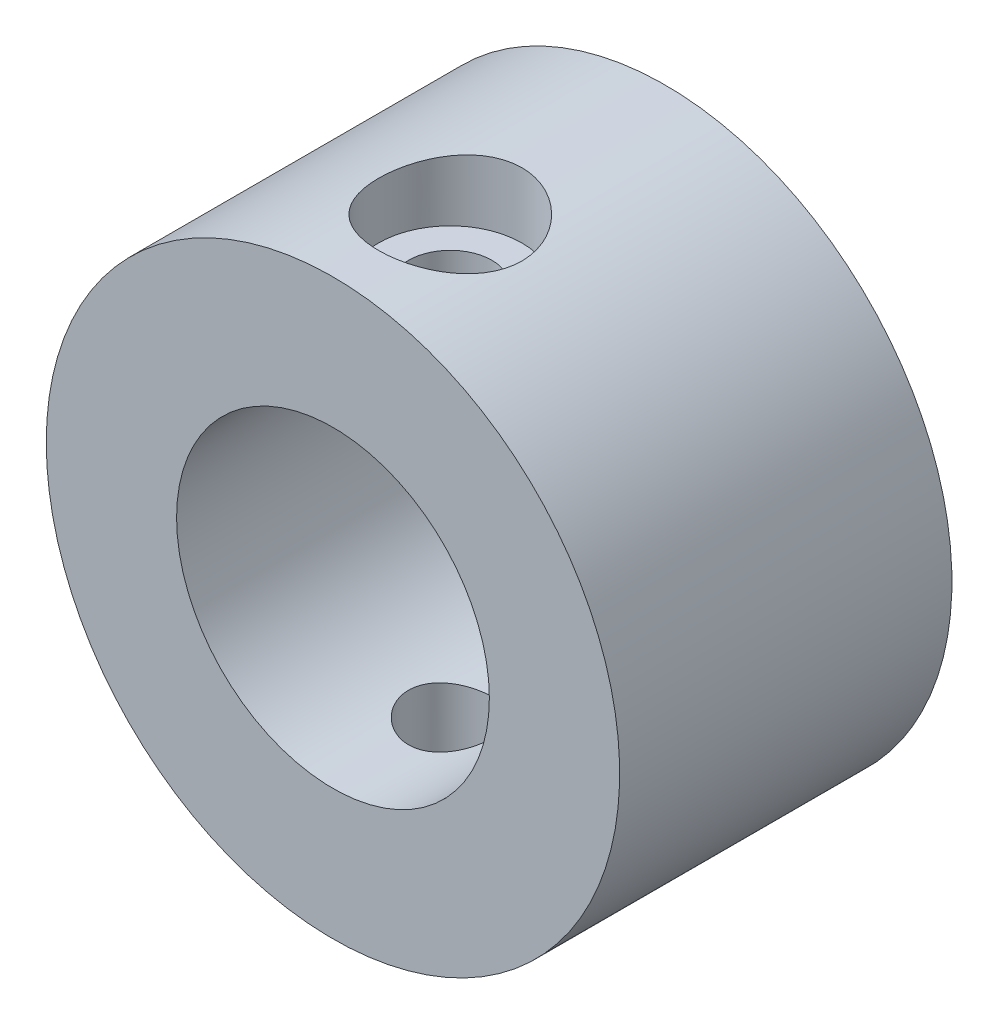
ISO-10303-21;
HEADER;
FILE_DESCRIPTION(('STEP AP214'),'2;1');
FILE_NAME('part.step','',(''),(''),'','','');
FILE_SCHEMA(('AUTOMOTIVE_DESIGN { 1 0 10303 214 1 1 1 1 }'));
ENDSEC;
DATA;
#1=APPLICATION_CONTEXT('core data for automotive mechanical design processes');
#2=APPLICATION_PROTOCOL_DEFINITION('international standard','automotive_design',2000,#1);
#3=PRODUCT_CONTEXT('',#1,'mechanical');
#4=PRODUCT('Part','Part','',(#3));
#5=PRODUCT_RELATED_PRODUCT_CATEGORY('part','',(#4));
#6=PRODUCT_DEFINITION_FORMATION('','',#4);
#7=PRODUCT_DEFINITION_CONTEXT('part definition',#1,'design');
#8=PRODUCT_DEFINITION('design','',#6,#7);
#9=PRODUCT_DEFINITION_SHAPE('','',#8);
#10=(LENGTH_UNIT() NAMED_UNIT(*) SI_UNIT(.MILLI.,.METRE.));
#11=(NAMED_UNIT(*) PLANE_ANGLE_UNIT() SI_UNIT($,.RADIAN.));
#12=(NAMED_UNIT(*) SI_UNIT($,.STERADIAN.) SOLID_ANGLE_UNIT());
#13=UNCERTAINTY_MEASURE_WITH_UNIT(LENGTH_MEASURE(1.E-05),#10,'distance_accuracy_value','');
#14=(GEOMETRIC_REPRESENTATION_CONTEXT(3) GLOBAL_UNCERTAINTY_ASSIGNED_CONTEXT((#13)) GLOBAL_UNIT_ASSIGNED_CONTEXT((#10,
#11,#12)) REPRESENTATION_CONTEXT('',''));
#15=CARTESIAN_POINT('',(0.,0.,0.));
#16=DIRECTION('',(0.,0.,1.));
#17=DIRECTION('',(1.,0.,0.));
#18=AXIS2_PLACEMENT_3D('',#15,#16,#17);
#19=CARTESIAN_POINT('',(0.,0.,0.));
#20=DIRECTION('',(0.,0.,1.));
#21=DIRECTION('',(-1.,0.,0.));
#22=AXIS2_PLACEMENT_3D('',#19,#20,#21);
#23=CYLINDRICAL_SURFACE('',#22,11.);
#24=CARTESIAN_POINT('',(0.,0.,-2.74688758676846));
#25=DIRECTION('',(0.,0.,-1.));
#26=DIRECTION('',(-1.,0.,0.));
#27=AXIS2_PLACEMENT_3D('',#24,#25,#26);
#28=CIRCLE('',#27,11.);
#29=CARTESIAN_POINT('',(-11.,0.,-2.74688758676847));
#30=VERTEX_POINT('',#29);
#31=EDGE_CURVE('E319',#30,#30,#28,.T.);
#32=ORIENTED_EDGE('',*,*,#31,.F.);
#33=EDGE_LOOP('',(#32));
#34=FACE_BOUND('',#33,.T.);
#35=CARTESIAN_POINT('',(0.,0.,10.));
#36=DIRECTION('',(0.,0.,-1.));
#37=DIRECTION('',(-1.,0.,0.));
#38=AXIS2_PLACEMENT_3D('',#35,#36,#37);
#39=CIRCLE('',#38,11.);
#40=CARTESIAN_POINT('',(-11.,0.,10.));
#41=VERTEX_POINT('',#40);
#42=EDGE_CURVE('E315',#41,#41,#39,.T.);
#43=ORIENTED_EDGE('',*,*,#42,.T.);
#44=EDGE_LOOP('',(#43));
#45=FACE_BOUND('',#44,.T.);
#46=CARTESIAN_POINT('',(0.,11.,2.75));
#47=CARTESIAN_POINT('',(-0.151939495894507,10.9999974309136,2.75000426385329));
#48=CARTESIAN_POINT('',(-0.303926622689732,10.9968205990835,2.76263450975194));
#49=CARTESIAN_POINT('',(-0.603544926912643,10.9844554202147,2.81274611072951));
#50=CARTESIAN_POINT('',(-0.751173585929689,10.9752636660329,2.85024155081939));
#51=CARTESIAN_POINT('',(-1.03770493233472,10.9518864827539,2.94880529801382));
#52=CARTESIAN_POINT('',(-1.17661786628834,10.9377070521044,3.00984529764466));
#53=CARTESIAN_POINT('',(-1.44223224182478,10.9058646364731,3.15366588174888));
#54=CARTESIAN_POINT('',(-1.56893327130607,10.8882015339929,3.23644719955144));
#55=CARTESIAN_POINT('',(-1.80913686671835,10.8509025825144,3.42320144769933));
#56=CARTESIAN_POINT('',(-1.92235209844527,10.8312362977156,3.52753788742494));
#57=CARTESIAN_POINT('',(-2.12987303320609,10.7923497021622,3.75366237566656));
#58=CARTESIAN_POINT('',(-2.22417660107352,10.7731294419809,3.87545239206938));
#59=CARTESIAN_POINT('',(-2.39254866179812,10.7370042211331,4.13525791568448));
#60=CARTESIAN_POINT('',(-2.46629572919609,10.7201378985215,4.273487589816));
#61=CARTESIAN_POINT('',(-2.58939433234303,10.6910740716636,4.5608720880434));
#62=CARTESIAN_POINT('',(-2.63874976830692,10.6788758210643,4.71002516110869));
#63=CARTESIAN_POINT('',(-2.7106838674754,10.6608420727659,5.01186308003637));
#64=CARTESIAN_POINT('',(-2.73377915860876,10.6548840016119,5.16441730940299));
#65=CARTESIAN_POINT('',(-2.75414658762175,10.6496383117592,5.4713423764988));
#66=CARTESIAN_POINT('',(-2.75142292666654,10.6503496078454,5.62571291460225));
#67=CARTESIAN_POINT('',(-2.72064196183946,10.6582521011416,5.92792898086648));
#68=CARTESIAN_POINT('',(-2.69320029034949,10.6652858218004,6.07584197268644));
#69=CARTESIAN_POINT('',(-2.61474434265549,10.6847896773029,6.36489526000361));
#70=CARTESIAN_POINT('',(-2.56372838712722,10.697260199436,6.50603507221969));
#71=CARTESIAN_POINT('',(-2.43904737621817,10.7263770882704,6.7791863631289));
#72=CARTESIAN_POINT('',(-2.36515888992702,10.7430643369466,6.91109131494754));
#73=CARTESIAN_POINT('',(-2.1969865060274,10.7787113655098,7.1608509678875));
#74=CARTESIAN_POINT('',(-2.10269903948287,10.7976715428015,7.27870320478996));
#75=CARTESIAN_POINT('',(-1.89321627858224,10.8363911432313,7.50053996210641));
#76=CARTESIAN_POINT('',(-1.77750147330408,10.85615794043,7.60403323177914));
#77=CARTESIAN_POINT('',(-1.53012184875678,10.8937760356105,7.79023894451715));
#78=CARTESIAN_POINT('',(-1.39845654246456,10.9116272750725,7.87295075281653));
#79=CARTESIAN_POINT('',(-1.12221246258255,10.9434917550602,8.01542607474471));
#80=CARTESIAN_POINT('',(-0.977590887549143,10.9574916023417,8.07510979046645));
#81=CARTESIAN_POINT('',(-0.679939348261952,10.979978478176,8.16918172713422));
#82=CARTESIAN_POINT('',(-0.526910998442555,10.9884665612201,8.20357478676659));
#83=CARTESIAN_POINT('',(-0.220989945715049,10.9988174866419,8.2453388701912));
#84=CARTESIAN_POINT('',(-0.068193986645052,11.0008443143184,8.25337888113805));
#85=CARTESIAN_POINT('',(0.236560270469432,10.9985114215983,8.24404349623161));
#86=CARTESIAN_POINT('',(0.38851864268176,10.9941522761006,8.22667038820158));
#87=CARTESIAN_POINT('',(0.684959492756899,10.9796423206681,8.16755333461581));
#88=CARTESIAN_POINT('',(0.829519384776042,10.9695782934061,8.12617435029222));
#89=CARTESIAN_POINT('',(1.10963836949628,10.9447929549596,8.02063701261449));
#90=CARTESIAN_POINT('',(1.24519655155986,10.9300711734496,7.95647635875909));
#91=CARTESIAN_POINT('',(1.50612574645469,10.8972106453141,7.80590043039643));
#92=CARTESIAN_POINT('',(1.63127331003224,10.879015901721,7.7191104606063));
#93=CARTESIAN_POINT('',(1.86546545834607,10.8413160017755,7.52621850053853));
#94=CARTESIAN_POINT('',(1.97450725811762,10.8218106196374,7.42011317736765));
#95=CARTESIAN_POINT('',(2.17614937479955,10.7830975442575,7.18849640511987));
#96=CARTESIAN_POINT('',(2.26828042397202,10.7639089100121,7.06257254450081));
#97=CARTESIAN_POINT('',(2.43010305819165,10.7285361036708,6.7966568368076));
#98=CARTESIAN_POINT('',(2.49979563929591,10.7123517982244,6.65666561455419));
#99=CARTESIAN_POINT('',(2.61424427111346,10.6849984031413,6.3673395089219));
#100=CARTESIAN_POINT('',(2.65914806051324,10.6737996791339,6.21806601476079));
#101=CARTESIAN_POINT('',(2.72313370989538,10.6576569737724,5.91376566393196));
#102=CARTESIAN_POINT('',(2.74222121703917,10.6527116245445,5.75874007312734));
#103=CARTESIAN_POINT('',(2.75373741561691,10.6497398557177,5.45211145625372));
#104=CARTESIAN_POINT('',(2.74691614593145,10.6515187667684,5.30053803560151));
#105=CARTESIAN_POINT('',(2.70852501023903,10.6613449983936,5.00077620411185));
#106=CARTESIAN_POINT('',(2.67695564159208,10.669392192995,4.85258772530915));
#107=CARTESIAN_POINT('',(2.59037408564545,10.6907397792054,4.56461782504592));
#108=CARTESIAN_POINT('',(2.53550257524744,10.7040086126716,4.42479160705939));
#109=CARTESIAN_POINT('',(2.40398567494254,10.7343088549492,4.15623013169179));
#110=CARTESIAN_POINT('',(2.32733726506265,10.7513407855459,4.02749641582405));
#111=CARTESIAN_POINT('',(2.15209087250144,10.7878032948327,3.78114984682957));
#112=CARTESIAN_POINT('',(2.05297246533914,10.8072848552493,3.66391469872273));
#113=CARTESIAN_POINT('',(1.83661384718117,10.8461471661815,3.44749708454177));
#114=CARTESIAN_POINT('',(1.71936933897876,10.8655278916626,3.34831891145956));
#115=CARTESIAN_POINT('',(1.46752390895475,10.9024236868739,3.16907926763155));
#116=CARTESIAN_POINT('',(1.33264710758004,10.9198986117076,3.0893965416021));
#117=CARTESIAN_POINT('',(1.0509877757692,10.9505902912105,2.95396298460903));
#118=CARTESIAN_POINT('',(0.904213866300687,10.9638100953293,2.89819500547768));
#119=CARTESIAN_POINT('',(0.631418797613031,10.9825477587016,2.82045164439564));
#120=CARTESIAN_POINT('',(0.506696979998125,10.9890473926327,2.79408938773537));
#121=CARTESIAN_POINT('',(0.254661131149852,10.9977744292524,2.75886243669311));
#122=CARTESIAN_POINT('',(0.127347295611463,11.0000021532664,2.74999642627361));
#123=CARTESIAN_POINT('',(0.,11.,2.75));
#124=B_SPLINE_CURVE_WITH_KNOTS('',3,(#46,#47,#48,#49,#50,#51,#52,#53,#54,#55,#56,#57,#58,#59,
#60,#61,#62,#63,#64,#65,#66,#67,#68,#69,#70,#71,#72,#73,#74,#75,#76,#77,#78,#79,#80,#81,#82,#83,
#84,#85,#86,#87,#88,#89,#90,#91,#92,#93,#94,#95,#96,#97,#98,#99,#100,#101,#102,#103,#104,#105,
#106,#107,#108,#109,#110,#111,#112,#113,#114,#115,#116,#117,#118,#119,#120,#121,#122,#123),
.UNSPECIFIED.,.T.,.F.,(4,2,2,2,2,2,2,2,2,2,2,2,2,2,2,2,2,2,2,2,2,2,2,2,2,2,2,2,2,2,2,2,2,2,2,2,
2,2,4),(0.,0.455351806198464,0.910961769233816,1.36602565419119,1.82110489031043,
2.28459798301422,2.74814337563447,3.21857520500646,3.68893178810509,4.14986541018628,
4.61072403212699,5.06041244518954,5.51013289693825,5.964393011082,6.41873266539053,
6.88602751782623,7.35333664196208,7.82225086522797,8.29107535101933,8.74790233079761,
9.20468818712783,9.65470503281823,10.1047673343029,10.5628157720923,11.0209433218746,
11.4903160021429,11.9596678438019,12.426191334674,12.8926127597352,13.3456359740823,
13.7986500843017,14.2489673436976,14.6993470826176,15.1614755676228,15.6237137792321,
16.0943234009335,16.5645950034992,16.9462744540472,17.3279251942302),.UNSPECIFIED.);
#125=CARTESIAN_POINT('',(0.,11.,2.75));
#126=VERTEX_POINT('',#125);
#127=EDGE_CURVE('E125',#126,#126,#124,.T.);
#128=ORIENTED_EDGE('',*,*,#127,.F.);
#129=EDGE_LOOP('',(#128));
#130=FACE_BOUND('',#129,.T.);
#131=CARTESIAN_POINT('',(0.,0.,2.65));
#132=DIRECTION('',(0.,0.,-1.));
#133=DIRECTION('',(-1.,0.,0.));
#134=AXIS2_PLACEMENT_3D('',#131,#132,#133);
#135=CIRCLE('',#134,11.);
#136=CARTESIAN_POINT('',(1.64544826719043,-10.8762355619948,2.65));
#137=VERTEX_POINT('',#136);
#138=CARTESIAN_POINT('',(-1.64544826719043,-10.8762355619948,2.65));
#139=VERTEX_POINT('',#138);
#140=EDGE_CURVE('E11',#137,#139,#135,.T.);
#141=ORIENTED_EDGE('',*,*,#140,.T.);
#142=CARTESIAN_POINT('',(0.,0.,-0.200000000000003));
#143=DIRECTION('',(-0.866025403784439,0.,-0.5));
#144=DIRECTION('',(-0.5,0.,0.866025403784439));
#145=AXIS2_PLACEMENT_3D('',#142,#143,#144);
#146=ELLIPSE('',#145,22.,11.);
#147=CARTESIAN_POINT('',(-3.29089653438087,-10.4961897848696,5.5));
#148=VERTEX_POINT('',#147);
#149=EDGE_CURVE('E317',#139,#148,#146,.T.);
#150=ORIENTED_EDGE('',*,*,#149,.T.);
#151=CARTESIAN_POINT('',(0.,0.,11.2));
#152=DIRECTION('',(-0.866025403784439,0.,0.5));
#153=DIRECTION('',(0.5,0.,0.866025403784439));
#154=AXIS2_PLACEMENT_3D('',#151,#152,#153);
#155=ELLIPSE('',#154,22.,11.);
#156=CARTESIAN_POINT('',(-1.64544826719043,-10.8762355619948,8.35));
#157=VERTEX_POINT('',#156);
#158=EDGE_CURVE('E346',#148,#157,#155,.T.);
#159=ORIENTED_EDGE('',*,*,#158,.T.);
#160=CARTESIAN_POINT('',(0.,0.,8.35));
#161=DIRECTION('',(0.,0.,1.));
#162=DIRECTION('',(1.,0.,0.));
#163=AXIS2_PLACEMENT_3D('',#160,#161,#162);
#164=CIRCLE('',#163,11.);
#165=CARTESIAN_POINT('',(1.64544826719043,-10.8762355619948,8.35));
#166=VERTEX_POINT('',#165);
#167=EDGE_CURVE('E342',#157,#166,#164,.T.);
#168=ORIENTED_EDGE('',*,*,#167,.T.);
#169=CARTESIAN_POINT('',(0.,0.,11.2));
#170=DIRECTION('',(0.866025403784439,0.,0.5));
#171=DIRECTION('',(-0.5,0.,0.866025403784439));
#172=AXIS2_PLACEMENT_3D('',#169,#170,#171);
#173=ELLIPSE('',#172,22.,11.);
#174=CARTESIAN_POINT('',(3.29089653438087,-10.4961897848696,5.5));
#175=VERTEX_POINT('',#174);
#176=EDGE_CURVE('E341',#166,#175,#173,.T.);
#177=ORIENTED_EDGE('',*,*,#176,.T.);
#178=CARTESIAN_POINT('',(0.,0.,-0.199999999999999));
#179=DIRECTION('',(0.866025403784439,0.,-0.5));
#180=DIRECTION('',(0.5,0.,0.866025403784439));
#181=AXIS2_PLACEMENT_3D('',#178,#179,#180);
#182=ELLIPSE('',#181,22.,11.);
#183=EDGE_CURVE('E43',#175,#137,#182,.T.);
#184=ORIENTED_EDGE('',*,*,#183,.T.);
#185=EDGE_LOOP('',(#141,#150,#159,#168,#177,#184));
#186=FACE_BOUND('',#185,.T.);
#187=ADVANCED_FACE('F35',(#34,#45,#130,#186),#23,.T.);
#188=CARTESIAN_POINT('',(0.,-11.,5.5));
#189=DIRECTION('',(0.,1.,0.));
#190=DIRECTION('',(0.,0.,-1.));
#191=AXIS2_PLACEMENT_3D('',#188,#189,#190);
#192=CYLINDRICAL_SURFACE('',#191,1.6);
#193=CARTESIAN_POINT('',(0.,6.,3.9));
#194=CARTESIAN_POINT('',(0.0882036446662834,5.9999986704813,3.90000209354788));
#195=CARTESIAN_POINT('',(0.176429728177472,5.99803588929723,3.90731809135174));
#196=CARTESIAN_POINT('',(0.350340361083571,5.99039658897325,3.93633698459095));
#197=CARTESIAN_POINT('',(0.436023666655269,5.98471828266059,3.95804680354089));
#198=CARTESIAN_POINT('',(0.60231327123625,5.97027466602242,4.01509733349123));
#199=CARTESIAN_POINT('',(0.682925960812229,5.96151333704337,4.05042047013283));
#200=CARTESIAN_POINT('',(0.837082949114126,5.94182959321305,4.13362979413328));
#201=CARTESIAN_POINT('',(0.910626776359695,5.93090703436005,4.18151681868739));
#202=CARTESIAN_POINT('',(1.05026360299202,5.90779691921738,4.28966681313074));
#203=CARTESIAN_POINT('',(1.11616935189025,5.8955877414348,4.35016693440678));
#204=CARTESIAN_POINT('',(1.23702970928508,5.87141927743138,4.48131878645052));
#205=CARTESIAN_POINT('',(1.29198290796523,5.85946002355797,4.55197182209339));
#206=CARTESIAN_POINT('',(1.39029127394741,5.83692429973529,4.702918587861));
#207=CARTESIAN_POINT('',(1.43343102189222,5.82637510858234,4.78335706261178));
#208=CARTESIAN_POINT('',(1.50550038461563,5.80817181846908,4.95067208887154));
#209=CARTESIAN_POINT('',(1.53443261960976,5.8005171857408,5.03754744985618));
#210=CARTESIAN_POINT('',(1.5766153618114,5.78919292669855,5.21319643026132));
#211=CARTESIAN_POINT('',(1.59020536195949,5.78543718352245,5.30188283196172));
#212=CARTESIAN_POINT('',(1.60237627764874,5.78207864835752,5.48035014666633));
#213=CARTESIAN_POINT('',(1.60095999764589,5.78247508038722,5.57013085202849));
#214=CARTESIAN_POINT('',(1.58342808002097,5.78729903015237,5.7455883322979));
#215=CARTESIAN_POINT('',(1.56772324851795,5.79161388402151,5.83130974563043));
#216=CARTESIAN_POINT('',(1.52271798977763,5.80360810471624,5.99885466756536));
#217=CARTESIAN_POINT('',(1.493416475944,5.81128774043995,6.08067786406037));
#218=CARTESIAN_POINT('',(1.421714855722,5.82924529396782,6.23917451504676));
#219=CARTESIAN_POINT('',(1.37917072910226,5.83955154254445,6.31577947142898));
#220=CARTESIAN_POINT('',(1.28229203059023,5.86158583714473,6.46090732708125));
#221=CARTESIAN_POINT('',(1.22795513779402,5.8733141628429,6.52942863132518));
#222=CARTESIAN_POINT('',(1.10693285810735,5.89734008503746,6.65879119796383));
#223=CARTESIAN_POINT('',(1.03990250182639,5.90964377191026,6.71930905465196));
#224=CARTESIAN_POINT('',(0.896494134565099,5.93309105021092,6.82831102428023));
#225=CARTESIAN_POINT('',(0.820115755364073,5.94423459590854,6.87679466296194));
#226=CARTESIAN_POINT('',(0.659678604397961,5.96417456318624,6.96049432225972));
#227=CARTESIAN_POINT('',(0.575587922041431,5.97296058266845,6.99565181635887));
#228=CARTESIAN_POINT('',(0.402401835512317,5.98712035520802,7.0512377510507));
#229=CARTESIAN_POINT('',(0.313307529542659,5.99249485386999,7.07166941017917));
#230=CARTESIAN_POINT('',(0.135403266516412,5.99911326846707,7.09671590153426));
#231=CARTESIAN_POINT('',(0.0466593901131035,6.00047197976769,7.10177043188069));
#232=CARTESIAN_POINT('',(-0.130408036720959,5.99923577353354,7.09713346860245));
#233=CARTESIAN_POINT('',(-0.218731629649689,5.99664126464274,7.08744349911539));
#234=CARTESIAN_POINT('',(-0.390881959921425,5.98786428396825,7.05395324203201));
#235=CARTESIAN_POINT('',(-0.474759881622231,5.98174421237093,7.03039820304177));
#236=CARTESIAN_POINT('',(-0.637365576940845,5.96661035915282,6.97013124439366));
#237=CARTESIAN_POINT('',(-0.716092791372797,5.9575962639682,6.93341789899964));
#238=CARTESIAN_POINT('',(-0.867870779734385,5.93740528447735,6.8470608902555));
#239=CARTESIAN_POINT('',(-0.94078015076904,5.92618949284386,6.79717802656153));
#240=CARTESIAN_POINT('',(-1.07734770831762,5.9028916189203,6.68619869587388));
#241=CARTESIAN_POINT('',(-1.14100406303899,5.89080936580444,6.62510001392018));
#242=CARTESIAN_POINT('',(-1.25911139583055,5.8667179669498,6.4913715380033));
#243=CARTESIAN_POINT('',(-1.31325215399989,5.85472049149563,6.41846515087989));
#244=CARTESIAN_POINT('',(-1.40853752947959,5.83253157740069,6.26434824312428));
#245=CARTESIAN_POINT('',(-1.44968268897221,5.82234006342218,6.18313806911701));
#246=CARTESIAN_POINT('',(-1.51749929269189,5.80503414721321,6.01512375432943));
#247=CARTESIAN_POINT('',(-1.54425449804718,5.79790198738987,5.9283553505015));
#248=CARTESIAN_POINT('',(-1.58272964096634,5.78751860185751,5.75132854421294));
#249=CARTESIAN_POINT('',(-1.5944534208239,5.78426638438256,5.66107103970634));
#250=CARTESIAN_POINT('',(-1.60231191722602,5.78209395637349,5.48280416970196));
#251=CARTESIAN_POINT('',(-1.59894524494388,5.78303518188826,5.39481814379578));
#252=CARTESIAN_POINT('',(-1.5778750080045,5.78881916870635,5.22071718878957));
#253=CARTESIAN_POINT('',(-1.56017181228047,5.7936618296109,5.1346022115989));
#254=CARTESIAN_POINT('',(-1.51122012559733,5.80662056856999,4.96731539829676));
#255=CARTESIAN_POINT('',(-1.48007728860457,5.81471108015306,4.88611052581443));
#256=CARTESIAN_POINT('',(-1.40521243649916,5.83325454509352,4.73001693557252));
#257=CARTESIAN_POINT('',(-1.36148844819695,5.84370786897202,4.65512921095956));
#258=CARTESIAN_POINT('',(-1.26119127415051,5.86618337152254,4.51141571240275));
#259=CARTESIAN_POINT('',(-1.20427783814327,5.87824266481322,4.44283317201904));
#260=CARTESIAN_POINT('',(-1.07986442808881,5.90236403026437,4.31603003866613));
#261=CARTESIAN_POINT('',(-1.012361883487,5.91442610238761,4.25781196906492));
#262=CARTESIAN_POINT('',(-0.866943984870946,5.93750249923166,4.15216620988252));
#263=CARTESIAN_POINT('',(-0.788836769401423,5.94848889051638,4.10499599148054));
#264=CARTESIAN_POINT('',(-0.625510912333512,5.9678704808232,4.02453006725651));
#265=CARTESIAN_POINT('',(-0.540296875757038,5.97626734146876,3.99122545946912));
#266=CARTESIAN_POINT('',(-0.379499763904793,5.98843802010774,3.94377977166759));
#267=CARTESIAN_POINT('',(-0.304609613252029,5.99274216474082,3.927400493126));
#268=CARTESIAN_POINT('',(-0.153151836253661,5.99852359229165,3.90551023506635));
#269=CARTESIAN_POINT('',(-0.0765843763238884,6.00000115437815,3.89999818223998));
#270=CARTESIAN_POINT('',(0.,6.,3.9));
#271=B_SPLINE_CURVE_WITH_KNOTS('',3,(#193,#194,#195,#196,#197,#198,#199,#200,#201,#202,#203,
#204,#205,#206,#207,#208,#209,#210,#211,#212,#213,#214,#215,#216,#217,#218,#219,#220,#221,#222,
#223,#224,#225,#226,#227,#228,#229,#230,#231,#232,#233,#234,#235,#236,#237,#238,#239,#240,#241,
#242,#243,#244,#245,#246,#247,#248,#249,#250,#251,#252,#253,#254,#255,#256,#257,#258,#259,#260,
#261,#262,#263,#264,#265,#266,#267,#268,#269,#270),.UNSPECIFIED.,.T.,.F.,(4,2,2,2,2,2,2,2,2,2,2,
2,2,2,2,2,2,2,2,2,2,2,2,2,2,2,2,2,2,2,2,2,2,2,2,2,2,2,4),(0.,0.264330079159655,0.52878739500916,
0.792904442377546,1.0570390936694,1.32667918363973,1.59635395940119,1.87066066018583,
2.1449167530376,2.41297726598071,2.68098768318787,2.94152801632129,3.20208917445683,
3.4655893867253,3.72914150489435,4.00129007845189,4.27344937545409,4.54679047677764,
4.82007181747442,5.08546174014969,5.35082423135612,5.61162828509024,5.87246060615823,
6.13840228798971,6.40439654602441,6.67789197101562,6.95137598414617,7.2232503815319,
7.49505526923061,7.75794673914764,8.0208314440835,8.28168612350517,8.54258173690277,
8.81115471648986,9.07979299457834,9.35417801816593,9.62838660908019,9.85791855186544,
10.0874278236498),.UNSPECIFIED.);
#272=CARTESIAN_POINT('',(0.,6.,3.9));
#273=VERTEX_POINT('',#272);
#274=EDGE_CURVE('E117',#273,#273,#271,.T.);
#275=ORIENTED_EDGE('',*,*,#274,.T.);
#276=EDGE_LOOP('',(#275));
#277=FACE_BOUND('',#276,.T.);
#278=CARTESIAN_POINT('',(0.,8.5,5.5));
#279=DIRECTION('',(0.,-1.,0.));
#280=DIRECTION('',(0.,0.,-1.));
#281=AXIS2_PLACEMENT_3D('',#278,#279,#280);
#282=CIRCLE('',#281,1.6);
#283=CARTESIAN_POINT('',(0.,8.5,3.9));
#284=VERTEX_POINT('',#283);
#285=EDGE_CURVE('E116',#284,#284,#282,.F.);
#286=ORIENTED_EDGE('',*,*,#285,.T.);
#287=EDGE_LOOP('',(#286));
#288=FACE_BOUND('',#287,.T.);
#289=ADVANCED_FACE('F148',(#277,#288),#192,.F.);
#290=CARTESIAN_POINT('',(0.,0.,0.));
#291=DIRECTION('',(0.,0.,-1.));
#292=DIRECTION('',(1.,0.,0.));
#293=AXIS2_PLACEMENT_3D('',#290,#291,#292);
#294=PLANE('',#293);
#295=CARTESIAN_POINT('',(0.,0.,0.));
#296=DIRECTION('',(0.,0.,-1.));
#297=DIRECTION('',(-1.,0.,0.));
#298=AXIS2_PLACEMENT_3D('',#295,#296,#297);
#299=CIRCLE('',#298,6.);
#300=CARTESIAN_POINT('',(-6.,0.,0.));
#301=VERTEX_POINT('',#300);
#302=EDGE_CURVE('E311',#301,#301,#299,.T.);
#303=ORIENTED_EDGE('',*,*,#302,.F.);
#304=EDGE_LOOP('',(#303));
#305=FACE_BOUND('',#304,.T.);
#306=ADVANCED_FACE('F37',(#305),#294,.F.);
#307=CARTESIAN_POINT('',(0.,0.,0.));
#308=DIRECTION('',(0.,0.,1.));
#309=DIRECTION('',(-1.,0.,0.));
#310=AXIS2_PLACEMENT_3D('',#307,#308,#309);
#311=CYLINDRICAL_SURFACE('',#310,6.);
#312=CARTESIAN_POINT('',(0.,-6.,3.9));
#313=CARTESIAN_POINT('',(-0.0882036446662834,-5.9999986704813,3.90000209354788));
#314=CARTESIAN_POINT('',(-0.176429728177473,-5.99803588929723,3.90731809135174));
#315=CARTESIAN_POINT('',(-0.350340361083571,-5.99039658897325,3.93633698459095));
#316=CARTESIAN_POINT('',(-0.436023666655269,-5.98471828266059,3.95804680354089));
#317=CARTESIAN_POINT('',(-0.60231327123625,-5.97027466602242,4.01509733349123));
#318=CARTESIAN_POINT('',(-0.682925960812229,-5.96151333704337,4.05042047013283));
#319=CARTESIAN_POINT('',(-0.837082949114126,-5.94182959321305,4.13362979413328));
#320=CARTESIAN_POINT('',(-0.910626776359695,-5.93090703436005,4.18151681868739));
#321=CARTESIAN_POINT('',(-1.05026360299202,-5.90779691921738,4.28966681313074));
#322=CARTESIAN_POINT('',(-1.11616935189025,-5.8955877414348,4.35016693440678));
#323=CARTESIAN_POINT('',(-1.23702970928508,-5.87141927743138,4.48131878645052));
#324=CARTESIAN_POINT('',(-1.29198290796523,-5.85946002355797,4.55197182209339));
#325=CARTESIAN_POINT('',(-1.3902912739474,-5.83692429973529,4.702918587861));
#326=CARTESIAN_POINT('',(-1.43343102189222,-5.82637510858234,4.78335706261178));
#327=CARTESIAN_POINT('',(-1.50550038461563,-5.80817181846908,4.95067208887154));
#328=CARTESIAN_POINT('',(-1.53443261960976,-5.8005171857408,5.03754744985618));
#329=CARTESIAN_POINT('',(-1.5766153618114,-5.78919292669855,5.21319643026132));
#330=CARTESIAN_POINT('',(-1.59020536195949,-5.78543718352245,5.30188283196172));
#331=CARTESIAN_POINT('',(-1.60237627764874,-5.78207864835752,5.48035014666633));
#332=CARTESIAN_POINT('',(-1.60095999764589,-5.78247508038722,5.57013085202849));
#333=CARTESIAN_POINT('',(-1.58342808002097,-5.78729903015237,5.7455883322979));
#334=CARTESIAN_POINT('',(-1.56772324851795,-5.79161388402151,5.83130974563043));
#335=CARTESIAN_POINT('',(-1.52271798977763,-5.80360810471625,5.99885466756536));
#336=CARTESIAN_POINT('',(-1.493416475944,-5.81128774043995,6.08067786406037));
#337=CARTESIAN_POINT('',(-1.421714855722,-5.82924529396782,6.23917451504676));
#338=CARTESIAN_POINT('',(-1.37917072910226,-5.83955154254445,6.31577947142898));
#339=CARTESIAN_POINT('',(-1.28229203059023,-5.86158583714473,6.46090732708125));
#340=CARTESIAN_POINT('',(-1.22795513779401,-5.8733141628429,6.52942863132518));
#341=CARTESIAN_POINT('',(-1.10693285810735,-5.89734008503746,6.65879119796383));
#342=CARTESIAN_POINT('',(-1.03990250182639,-5.90964377191026,6.71930905465196));
#343=CARTESIAN_POINT('',(-0.896494134565099,-5.93309105021092,6.82831102428023));
#344=CARTESIAN_POINT('',(-0.820115755364072,-5.94423459590854,6.87679466296194));
#345=CARTESIAN_POINT('',(-0.659678604397961,-5.96417456318624,6.96049432225972));
#346=CARTESIAN_POINT('',(-0.575587922041431,-5.97296058266845,6.99565181635887));
#347=CARTESIAN_POINT('',(-0.402401835512317,-5.98712035520802,7.0512377510507));
#348=CARTESIAN_POINT('',(-0.313307529542659,-5.99249485386999,7.07166941017917));
#349=CARTESIAN_POINT('',(-0.135403266516412,-5.99911326846707,7.09671590153426));
#350=CARTESIAN_POINT('',(-0.046659390113104,-6.00047197976769,7.10177043188069));
#351=CARTESIAN_POINT('',(0.130408036720958,-5.99923577353354,7.09713346860245));
#352=CARTESIAN_POINT('',(0.218731629649689,-5.99664126464274,7.08744349911539));
#353=CARTESIAN_POINT('',(0.390881959921425,-5.98786428396825,7.05395324203201));
#354=CARTESIAN_POINT('',(0.474759881622232,-5.98174421237093,7.03039820304177));
#355=CARTESIAN_POINT('',(0.637365576940845,-5.96661035915282,6.97013124439366));
#356=CARTESIAN_POINT('',(0.716092791372797,-5.9575962639682,6.93341789899964));
#357=CARTESIAN_POINT('',(0.867870779734385,-5.93740528447734,6.8470608902555));
#358=CARTESIAN_POINT('',(0.94078015076904,-5.92618949284386,6.79717802656153));
#359=CARTESIAN_POINT('',(1.07734770831762,-5.9028916189203,6.68619869587388));
#360=CARTESIAN_POINT('',(1.14100406303899,-5.89080936580444,6.62510001392018));
#361=CARTESIAN_POINT('',(1.25911139583055,-5.8667179669498,6.4913715380033));
#362=CARTESIAN_POINT('',(1.31325215399989,-5.85472049149563,6.41846515087989));
#363=CARTESIAN_POINT('',(1.40853752947959,-5.83253157740069,6.26434824312428));
#364=CARTESIAN_POINT('',(1.44968268897221,-5.82234006342218,6.18313806911701));
#365=CARTESIAN_POINT('',(1.51749929269189,-5.80503414721321,6.01512375432943));
#366=CARTESIAN_POINT('',(1.54425449804718,-5.79790198738987,5.9283553505015));
#367=CARTESIAN_POINT('',(1.58272964096634,-5.78751860185751,5.75132854421294));
#368=CARTESIAN_POINT('',(1.5944534208239,-5.78426638438256,5.66107103970634));
#369=CARTESIAN_POINT('',(1.60231191722602,-5.78209395637348,5.48280416970196));
#370=CARTESIAN_POINT('',(1.59894524494388,-5.78303518188826,5.39481814379578));
#371=CARTESIAN_POINT('',(1.5778750080045,-5.78881916870635,5.22071718878957));
#372=CARTESIAN_POINT('',(1.56017181228047,-5.7936618296109,5.13460221159889));
#373=CARTESIAN_POINT('',(1.51122012559733,-5.80662056856999,4.96731539829676));
#374=CARTESIAN_POINT('',(1.48007728860457,-5.81471108015306,4.88611052581442));
#375=CARTESIAN_POINT('',(1.40521243649916,-5.83325454509352,4.73001693557252));
#376=CARTESIAN_POINT('',(1.36148844819695,-5.84370786897202,4.65512921095956));
#377=CARTESIAN_POINT('',(1.26119127415051,-5.86618337152254,4.51141571240275));
#378=CARTESIAN_POINT('',(1.20427783814327,-5.87824266481322,4.44283317201904));
#379=CARTESIAN_POINT('',(1.0798644280888,-5.90236403026437,4.31603003866613));
#380=CARTESIAN_POINT('',(1.012361883487,-5.91442610238761,4.25781196906492));
#381=CARTESIAN_POINT('',(0.866943984870946,-5.93750249923166,4.15216620988252));
#382=CARTESIAN_POINT('',(0.788836769401422,-5.94848889051638,4.10499599148054));
#383=CARTESIAN_POINT('',(0.625510912333511,-5.9678704808232,4.02453006725651));
#384=CARTESIAN_POINT('',(0.540296875757037,-5.97626734146876,3.99122545946912));
#385=CARTESIAN_POINT('',(0.379499763904793,-5.98843802010774,3.94377977166759));
#386=CARTESIAN_POINT('',(0.304609613252029,-5.99274216474082,3.927400493126));
#387=CARTESIAN_POINT('',(0.153151836253661,-5.99852359229165,3.90551023506635));
#388=CARTESIAN_POINT('',(0.0765843763238883,-6.00000115437815,3.89999818223998));
#389=CARTESIAN_POINT('',(0.,-6.,3.9));
#390=B_SPLINE_CURVE_WITH_KNOTS('',3,(#312,#313,#314,#315,#316,#317,#318,#319,#320,#321,#322,
#323,#324,#325,#326,#327,#328,#329,#330,#331,#332,#333,#334,#335,#336,#337,#338,#339,#340,#341,
#342,#343,#344,#345,#346,#347,#348,#349,#350,#351,#352,#353,#354,#355,#356,#357,#358,#359,#360,
#361,#362,#363,#364,#365,#366,#367,#368,#369,#370,#371,#372,#373,#374,#375,#376,#377,#378,#379,
#380,#381,#382,#383,#384,#385,#386,#387,#388,#389),.UNSPECIFIED.,.T.,.F.,(4,2,2,2,2,2,2,2,2,2,2,
2,2,2,2,2,2,2,2,2,2,2,2,2,2,2,2,2,2,2,2,2,2,2,2,2,2,2,4),(0.,0.264330079159655,0.52878739500916,
0.792904442377546,1.0570390936694,1.32667918363973,1.59635395940119,1.87066066018583,
2.1449167530376,2.41297726598071,2.68098768318787,2.94152801632129,3.20208917445683,
3.4655893867253,3.72914150489435,4.00129007845189,4.27344937545409,4.54679047677765,
4.82007181747443,5.08546174014969,5.35082423135612,5.61162828509024,5.87246060615823,
6.13840228798972,6.40439654602441,6.67789197101562,6.95137598414617,7.2232503815319,
7.49505526923061,7.75794673914764,8.0208314440835,8.28168612350517,8.54258173690277,
8.81115471648986,9.07979299457834,9.35417801816593,9.62838660908019,9.85791855186544,
10.0874278236498),.UNSPECIFIED.);
#391=CARTESIAN_POINT('',(0.,-6.,3.9));
#392=VERTEX_POINT('',#391);
#393=EDGE_CURVE('E124',#392,#392,#390,.T.);
#394=ORIENTED_EDGE('',*,*,#393,.F.);
#395=EDGE_LOOP('',(#394));
#396=FACE_BOUND('',#395,.T.);
#397=ORIENTED_EDGE('',*,*,#274,.F.);
#398=EDGE_LOOP('',(#397));
#399=FACE_BOUND('',#398,.T.);
#400=ORIENTED_EDGE('',*,*,#302,.T.);
#401=EDGE_LOOP('',(#400));
#402=FACE_BOUND('',#401,.T.);
#403=CARTESIAN_POINT('',(0.,0.,10.));
#404=DIRECTION('',(0.,0.,-1.));
#405=DIRECTION('',(-1.,0.,0.));
#406=AXIS2_PLACEMENT_3D('',#403,#404,#405);
#407=CIRCLE('',#406,6.);
#408=CARTESIAN_POINT('',(-6.,0.,10.));
#409=VERTEX_POINT('',#408);
#410=EDGE_CURVE('E314',#409,#409,#407,.T.);
#411=ORIENTED_EDGE('',*,*,#410,.F.);
#412=EDGE_LOOP('',(#411));
#413=FACE_BOUND('',#412,.T.);
#414=ADVANCED_FACE('F134',(#396,#399,#402,#413),#311,.F.);
#415=CARTESIAN_POINT('',(6.,0.,10.));
#416=DIRECTION('',(0.,0.,-1.));
#417=DIRECTION('',(1.,0.,0.));
#418=AXIS2_PLACEMENT_3D('',#415,#416,#417);
#419=PLANE('',#418);
#420=ORIENTED_EDGE('',*,*,#410,.T.);
#421=EDGE_LOOP('',(#420));
#422=FACE_BOUND('',#421,.T.);
#423=ORIENTED_EDGE('',*,*,#42,.F.);
#424=EDGE_LOOP('',(#423));
#425=FACE_BOUND('',#424,.T.);
#426=ADVANCED_FACE('F138',(#422,#425),#419,.F.);
#427=CARTESIAN_POINT('',(0.,0.,19.));
#428=DIRECTION('',(0.,0.,1.));
#429=DIRECTION('',(-1.,0.,0.));
#430=AXIS2_PLACEMENT_3D('',#427,#428,#429);
#431=DEGENERATE_TOROIDAL_SURFACE('',#430,0.847518515729481,24.,.T.);
#432=ORIENTED_EDGE('',*,*,#31,.T.);
#433=EDGE_LOOP('',(#432));
#434=FACE_BOUND('',#433,.T.);
#435=CARTESIAN_POINT('',(0.,0.,-5.));
#436=DIRECTION('',(0.,0.,-1.));
#437=DIRECTION('',(-1.,0.,0.));
#438=AXIS2_PLACEMENT_3D('',#435,#436,#437);
#439=CIRCLE('',#438,0.847518515729481);
#440=CARTESIAN_POINT('',(-0.84751851572948,0.,-5.));
#441=VERTEX_POINT('',#440);
#442=EDGE_CURVE('E323',#441,#441,#439,.T.);
#443=ORIENTED_EDGE('',*,*,#442,.F.);
#444=EDGE_LOOP('',(#443));
#445=FACE_BOUND('',#444,.T.);
#446=ADVANCED_FACE('F143',(#434,#445),#431,.T.);
#447=CARTESIAN_POINT('',(0.,0.,-5.));
#448=DIRECTION('',(0.,0.,1.));
#449=DIRECTION('',(-1.,0.,0.));
#450=AXIS2_PLACEMENT_3D('',#447,#448,#449);
#451=PLANE('',#450);
#452=ORIENTED_EDGE('',*,*,#442,.T.);
#453=EDGE_LOOP('',(#452));
#454=FACE_BOUND('',#453,.T.);
#455=ADVANCED_FACE('F228',(#454),#451,.F.);
#456=CARTESIAN_POINT('',(0.,-8.5,5.5));
#457=DIRECTION('',(0.,-1.,0.));
#458=DIRECTION('',(0.,0.,-1.));
#459=AXIS2_PLACEMENT_3D('',#456,#457,#458);
#460=CIRCLE('',#459,1.6);
#461=CARTESIAN_POINT('',(0.,-8.5,3.9));
#462=VERTEX_POINT('',#461);
#463=EDGE_CURVE('E105',#462,#462,#460,.F.);
#464=ORIENTED_EDGE('',*,*,#463,.F.);
#465=EDGE_LOOP('',(#464));
#466=FACE_BOUND('',#465,.T.);
#467=ORIENTED_EDGE('',*,*,#393,.T.);
#468=EDGE_LOOP('',(#467));
#469=FACE_BOUND('',#468,.T.);
#470=ADVANCED_FACE('F130',(#466,#469),#192,.F.);
#471=CARTESIAN_POINT('',(0.,8.5,5.5));
#472=DIRECTION('',(0.,1.,0.));
#473=DIRECTION('',(0.,0.,-1.));
#474=AXIS2_PLACEMENT_3D('',#471,#472,#473);
#475=CYLINDRICAL_SURFACE('',#474,2.75);
#476=CARTESIAN_POINT('',(0.,8.5,5.5));
#477=DIRECTION('',(0.,-1.,0.));
#478=DIRECTION('',(0.,0.,-1.));
#479=AXIS2_PLACEMENT_3D('',#476,#477,#478);
#480=CIRCLE('',#479,2.75);
#481=CARTESIAN_POINT('',(0.,8.5,2.75));
#482=VERTEX_POINT('',#481);
#483=EDGE_CURVE('E108',#482,#482,#480,.T.);
#484=ORIENTED_EDGE('',*,*,#483,.T.);
#485=EDGE_LOOP('',(#484));
#486=FACE_BOUND('',#485,.T.);
#487=ORIENTED_EDGE('',*,*,#127,.T.);
#488=EDGE_LOOP('',(#487));
#489=FACE_BOUND('',#488,.T.);
#490=ADVANCED_FACE('F158',(#486,#489),#475,.F.);
#491=CARTESIAN_POINT('',(0.,8.5,5.5));
#492=DIRECTION('',(0.,1.,0.));
#493=DIRECTION('',(0.,0.,-1.));
#494=AXIS2_PLACEMENT_3D('',#491,#492,#493);
#495=PLANE('',#494);
#496=ORIENTED_EDGE('',*,*,#483,.F.);
#497=EDGE_LOOP('',(#496));
#498=FACE_BOUND('',#497,.T.);
#499=ORIENTED_EDGE('',*,*,#285,.F.);
#500=EDGE_LOOP('',(#499));
#501=FACE_BOUND('',#500,.T.);
#502=ADVANCED_FACE('F162',(#498,#501),#495,.T.);
#503=CARTESIAN_POINT('',(-1.64544826719043,-8.5,2.65));
#504=DIRECTION('',(0.,0.,1.));
#505=DIRECTION('',(-1.,0.,0.));
#506=AXIS2_PLACEMENT_3D('',#503,#504,#505);
#507=PLANE('',#506);
#508=ORIENTED_EDGE('',*,*,#140,.F.);
#509=DIRECTION('',(0.,-1.,0.));
#510=VECTOR('',#509,1.);
#511=CARTESIAN_POINT('',(1.64544826719043,-8.5,2.65));
#512=LINE('',#511,#510);
#513=CARTESIAN_POINT('',(1.64544826719043,-8.5,2.65));
#514=VERTEX_POINT('',#513);
#515=EDGE_CURVE('E58',#514,#137,#512,.T.);
#516=ORIENTED_EDGE('',*,*,#515,.F.);
#517=DIRECTION('',(1.,0.,0.));
#518=VECTOR('',#517,1.);
#519=CARTESIAN_POINT('',(-1.64544826719043,-8.5,2.65));
#520=LINE('',#519,#518);
#521=CARTESIAN_POINT('',(-1.64544826719043,-8.5,2.65));
#522=VERTEX_POINT('',#521);
#523=EDGE_CURVE('E97',#522,#514,#520,.T.);
#524=ORIENTED_EDGE('',*,*,#523,.F.);
#525=DIRECTION('',(0.,-1.,0.));
#526=VECTOR('',#525,1.);
#527=CARTESIAN_POINT('',(-1.64544826719043,-8.5,2.65));
#528=LINE('',#527,#526);
#529=EDGE_CURVE('E50',#522,#139,#528,.T.);
#530=ORIENTED_EDGE('',*,*,#529,.T.);
#531=EDGE_LOOP('',(#508,#516,#524,#530));
#532=FACE_BOUND('',#531,.T.);
#533=ADVANCED_FACE('F104',(#532),#507,.T.);
#534=CARTESIAN_POINT('',(1.64544826719043,-8.5,2.65));
#535=DIRECTION('',(-0.866025403784439,0.,0.5));
#536=DIRECTION('',(-0.5,0.,-0.866025403784439));
#537=AXIS2_PLACEMENT_3D('',#534,#535,#536);
#538=PLANE('',#537);
#539=ORIENTED_EDGE('',*,*,#183,.F.);
#540=DIRECTION('',(0.,-1.,0.));
#541=VECTOR('',#540,1.);
#542=CARTESIAN_POINT('',(3.29089653438087,-8.5,5.5));
#543=LINE('',#542,#541);
#544=CARTESIAN_POINT('',(3.29089653438087,-8.5,5.5));
#545=VERTEX_POINT('',#544);
#546=EDGE_CURVE('E93',#545,#175,#543,.T.);
#547=ORIENTED_EDGE('',*,*,#546,.F.);
#548=DIRECTION('',(0.5,0.,0.866025403784438));
#549=VECTOR('',#548,1.);
#550=CARTESIAN_POINT('',(1.64544826719043,-8.5,2.65));
#551=LINE('',#550,#549);
#552=EDGE_CURVE('E90',#514,#545,#551,.T.);
#553=ORIENTED_EDGE('',*,*,#552,.F.);
#554=ORIENTED_EDGE('',*,*,#515,.T.);
#555=EDGE_LOOP('',(#539,#547,#553,#554));
#556=FACE_BOUND('',#555,.T.);
#557=ADVANCED_FACE('F92',(#556),#538,.T.);
#558=CARTESIAN_POINT('',(3.29089653438087,-8.5,5.5));
#559=DIRECTION('',(-0.866025403784439,0.,-0.5));
#560=DIRECTION('',(0.5,0.,-0.866025403784439));
#561=AXIS2_PLACEMENT_3D('',#558,#559,#560);
#562=PLANE('',#561);
#563=ORIENTED_EDGE('',*,*,#176,.F.);
#564=DIRECTION('',(0.,-1.,0.));
#565=VECTOR('',#564,1.);
#566=CARTESIAN_POINT('',(1.64544826719043,-8.5,8.35));
#567=LINE('',#566,#565);
#568=CARTESIAN_POINT('',(1.64544826719043,-8.5,8.35));
#569=VERTEX_POINT('',#568);
#570=EDGE_CURVE('E110',#569,#166,#567,.T.);
#571=ORIENTED_EDGE('',*,*,#570,.F.);
#572=DIRECTION('',(-0.5,0.,0.866025403784439));
#573=VECTOR('',#572,1.);
#574=CARTESIAN_POINT('',(3.29089653438087,-8.5,5.5));
#575=LINE('',#574,#573);
#576=EDGE_CURVE('E96',#545,#569,#575,.T.);
#577=ORIENTED_EDGE('',*,*,#576,.F.);
#578=ORIENTED_EDGE('',*,*,#546,.T.);
#579=EDGE_LOOP('',(#563,#571,#577,#578));
#580=FACE_BOUND('',#579,.T.);
#581=ADVANCED_FACE('F171',(#580),#562,.T.);
#582=CARTESIAN_POINT('',(1.64544826719043,-8.5,8.35));
#583=DIRECTION('',(0.,0.,-1.));
#584=DIRECTION('',(1.,0.,0.));
#585=AXIS2_PLACEMENT_3D('',#582,#583,#584);
#586=PLANE('',#585);
#587=ORIENTED_EDGE('',*,*,#167,.F.);
#588=DIRECTION('',(0.,-1.,0.));
#589=VECTOR('',#588,1.);
#590=CARTESIAN_POINT('',(-1.64544826719043,-8.5,8.35));
#591=LINE('',#590,#589);
#592=CARTESIAN_POINT('',(-1.64544826719043,-8.5,8.35));
#593=VERTEX_POINT('',#592);
#594=EDGE_CURVE('E352',#593,#157,#591,.T.);
#595=ORIENTED_EDGE('',*,*,#594,.F.);
#596=DIRECTION('',(-1.,0.,0.));
#597=VECTOR('',#596,1.);
#598=CARTESIAN_POINT('',(1.64544826719043,-8.5,8.35));
#599=LINE('',#598,#597);
#600=EDGE_CURVE('E357',#569,#593,#599,.T.);
#601=ORIENTED_EDGE('',*,*,#600,.F.);
#602=ORIENTED_EDGE('',*,*,#570,.T.);
#603=EDGE_LOOP('',(#587,#595,#601,#602));
#604=FACE_BOUND('',#603,.T.);
#605=ADVANCED_FACE('F174',(#604),#586,.T.);
#606=CARTESIAN_POINT('',(-1.64544826719043,-8.5,8.35));
#607=DIRECTION('',(0.866025403784439,0.,-0.5));
#608=DIRECTION('',(0.5,0.,0.866025403784439));
#609=AXIS2_PLACEMENT_3D('',#606,#607,#608);
#610=PLANE('',#609);
#611=ORIENTED_EDGE('',*,*,#158,.F.);
#612=DIRECTION('',(0.,-1.,0.));
#613=VECTOR('',#612,1.);
#614=CARTESIAN_POINT('',(-3.29089653438087,-8.5,5.5));
#615=LINE('',#614,#613);
#616=CARTESIAN_POINT('',(-3.29089653438087,-8.5,5.5));
#617=VERTEX_POINT('',#616);
#618=EDGE_CURVE('E350',#617,#148,#615,.T.);
#619=ORIENTED_EDGE('',*,*,#618,.F.);
#620=DIRECTION('',(-0.5,0.,-0.866025403784439));
#621=VECTOR('',#620,1.);
#622=CARTESIAN_POINT('',(-1.64544826719043,-8.5,8.35));
#623=LINE('',#622,#621);
#624=EDGE_CURVE('E353',#593,#617,#623,.T.);
#625=ORIENTED_EDGE('',*,*,#624,.F.);
#626=ORIENTED_EDGE('',*,*,#594,.T.);
#627=EDGE_LOOP('',(#611,#619,#625,#626));
#628=FACE_BOUND('',#627,.T.);
#629=ADVANCED_FACE('F178',(#628),#610,.T.);
#630=CARTESIAN_POINT('',(-3.29089653438087,-8.5,5.5));
#631=DIRECTION('',(0.866025403784439,0.,0.5));
#632=DIRECTION('',(-0.5,0.,0.866025403784439));
#633=AXIS2_PLACEMENT_3D('',#630,#631,#632);
#634=PLANE('',#633);
#635=ORIENTED_EDGE('',*,*,#149,.F.);
#636=ORIENTED_EDGE('',*,*,#529,.F.);
#637=DIRECTION('',(0.5,0.,-0.866025403784439));
#638=VECTOR('',#637,1.);
#639=CARTESIAN_POINT('',(-3.29089653438087,-8.5,5.5));
#640=LINE('',#639,#638);
#641=EDGE_CURVE('E102',#617,#522,#640,.T.);
#642=ORIENTED_EDGE('',*,*,#641,.F.);
#643=ORIENTED_EDGE('',*,*,#618,.T.);
#644=EDGE_LOOP('',(#635,#636,#642,#643));
#645=FACE_BOUND('',#644,.T.);
#646=ADVANCED_FACE('F182',(#645),#634,.T.);
#647=CARTESIAN_POINT('',(0.,-8.5,0.));
#648=DIRECTION('',(0.,1.,0.));
#649=DIRECTION('',(0.,0.,-1.));
#650=AXIS2_PLACEMENT_3D('',#647,#648,#649);
#651=PLANE('',#650);
#652=ORIENTED_EDGE('',*,*,#523,.T.);
#653=ORIENTED_EDGE('',*,*,#552,.T.);
#654=ORIENTED_EDGE('',*,*,#576,.T.);
#655=ORIENTED_EDGE('',*,*,#600,.T.);
#656=ORIENTED_EDGE('',*,*,#624,.T.);
#657=ORIENTED_EDGE('',*,*,#641,.T.);
#658=EDGE_LOOP('',(#652,#653,#654,#655,#656,#657));
#659=FACE_BOUND('',#658,.T.);
#660=ORIENTED_EDGE('',*,*,#463,.T.);
#661=EDGE_LOOP('',(#660));
#662=FACE_BOUND('',#661,.T.);
#663=ADVANCED_FACE('F99',(#659,#662),#651,.F.);
#664=CLOSED_SHELL('',(#187,#289,#306,#414,#426,#446,#455,#470,#490,#502,#533,#557,#581,#605,
#629,#646,#663));
#665=MANIFOLD_SOLID_BREP('B2',#664);
#666=ADVANCED_BREP_SHAPE_REPRESENTATION('',(#18,#665),#14);
#667=SHAPE_DEFINITION_REPRESENTATION(#9,#666);
ENDSEC;
END-ISO-10303-21;
